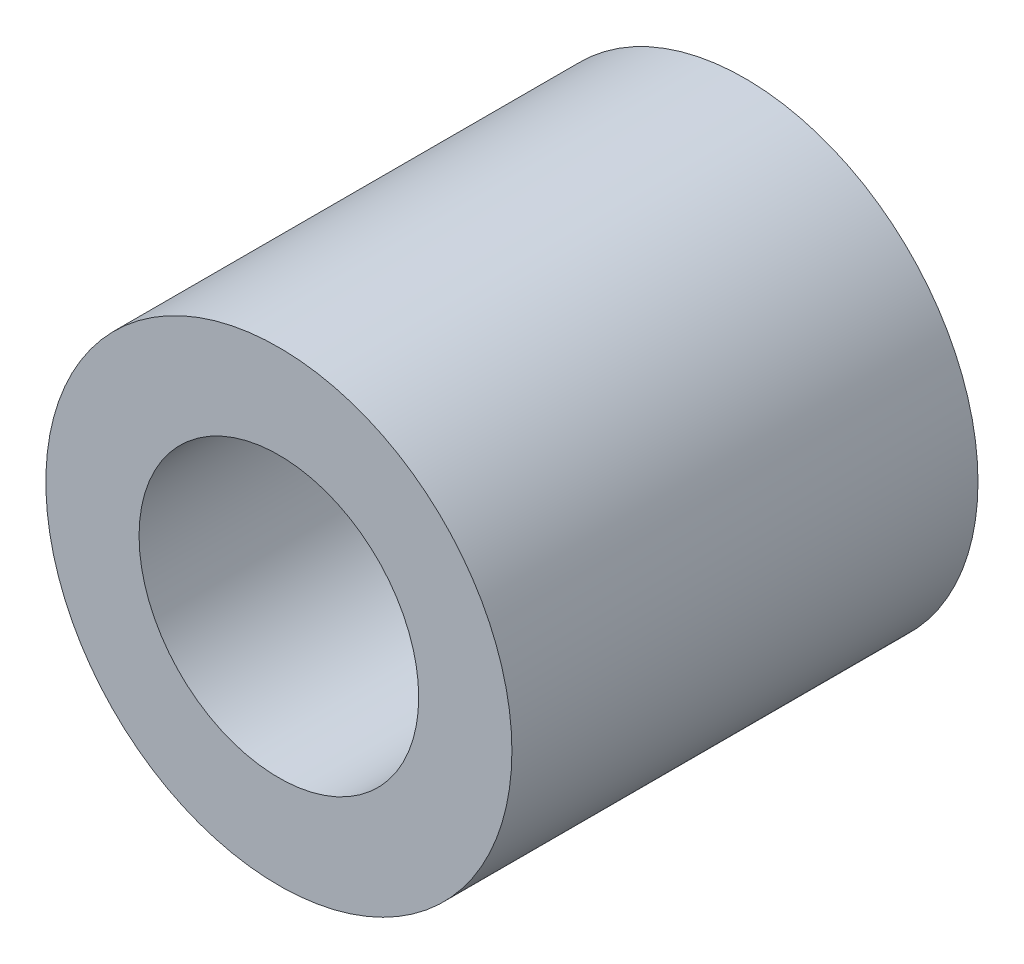
ISO-10303-21;
HEADER;
FILE_DESCRIPTION(('STEP AP214'),'2;1');
FILE_NAME('part.step','',(''),(''),'','','');
FILE_SCHEMA(('AUTOMOTIVE_DESIGN { 1 0 10303 214 1 1 1 1 }'));
ENDSEC;
DATA;
#1=APPLICATION_CONTEXT('core data for automotive mechanical design processes');
#2=APPLICATION_PROTOCOL_DEFINITION('international standard','automotive_design',2000,#1);
#3=PRODUCT_CONTEXT('',#1,'mechanical');
#4=PRODUCT('Part','Part','',(#3));
#5=PRODUCT_RELATED_PRODUCT_CATEGORY('part','',(#4));
#6=PRODUCT_DEFINITION_FORMATION('','',#4);
#7=PRODUCT_DEFINITION_CONTEXT('part definition',#1,'design');
#8=PRODUCT_DEFINITION('design','',#6,#7);
#9=PRODUCT_DEFINITION_SHAPE('','',#8);
#10=(LENGTH_UNIT() NAMED_UNIT(*) SI_UNIT(.MILLI.,.METRE.));
#11=(NAMED_UNIT(*) PLANE_ANGLE_UNIT() SI_UNIT($,.RADIAN.));
#12=(NAMED_UNIT(*) SI_UNIT($,.STERADIAN.) SOLID_ANGLE_UNIT());
#13=UNCERTAINTY_MEASURE_WITH_UNIT(LENGTH_MEASURE(1.E-05),#10,'distance_accuracy_value','');
#14=(GEOMETRIC_REPRESENTATION_CONTEXT(3) GLOBAL_UNCERTAINTY_ASSIGNED_CONTEXT((#13)) GLOBAL_UNIT_ASSIGNED_CONTEXT((#10,
#11,#12)) REPRESENTATION_CONTEXT('',''));
#15=CARTESIAN_POINT('',(0.,0.,0.));
#16=DIRECTION('',(0.,0.,1.));
#17=DIRECTION('',(1.,0.,0.));
#18=AXIS2_PLACEMENT_3D('',#15,#16,#17);
#19=CARTESIAN_POINT('',(0.,0.,5.));
#20=DIRECTION('',(0.,0.,-1.));
#21=DIRECTION('',(-1.,0.,0.));
#22=AXIS2_PLACEMENT_3D('',#19,#20,#21);
#23=CYLINDRICAL_SURFACE('',#22,2.5);
#24=CARTESIAN_POINT('',(0.,0.,5.));
#25=DIRECTION('',(0.,0.,1.));
#26=DIRECTION('',(1.,0.,0.));
#27=AXIS2_PLACEMENT_3D('',#24,#25,#26);
#28=CIRCLE('',#27,2.5);
#29=CARTESIAN_POINT('',(2.5,0.,5.));
#30=VERTEX_POINT('',#29);
#31=EDGE_CURVE('E10',#30,#30,#28,.T.);
#32=ORIENTED_EDGE('',*,*,#31,.F.);
#33=EDGE_LOOP('',(#32));
#34=FACE_BOUND('',#33,.T.);
#35=CARTESIAN_POINT('',(0.,0.,0.));
#36=DIRECTION('',(0.,0.,1.));
#37=DIRECTION('',(1.,0.,0.));
#38=AXIS2_PLACEMENT_3D('',#35,#36,#37);
#39=CIRCLE('',#38,2.5);
#40=CARTESIAN_POINT('',(2.5,0.,0.));
#41=VERTEX_POINT('',#40);
#42=EDGE_CURVE('E35',#41,#41,#39,.T.);
#43=ORIENTED_EDGE('',*,*,#42,.T.);
#44=EDGE_LOOP('',(#43));
#45=FACE_BOUND('',#44,.T.);
#46=ADVANCED_FACE('F32',(#34,#45),#23,.T.);
#47=CARTESIAN_POINT('',(0.,0.,5.));
#48=DIRECTION('',(0.,0.,1.));
#49=DIRECTION('',(1.,0.,0.));
#50=AXIS2_PLACEMENT_3D('',#47,#48,#49);
#51=PLANE('',#50);
#52=CARTESIAN_POINT('',(0.,0.,5.));
#53=DIRECTION('',(0.,0.,1.));
#54=DIRECTION('',(1.,0.,0.));
#55=AXIS2_PLACEMENT_3D('',#52,#53,#54);
#56=CIRCLE('',#55,1.5);
#57=CARTESIAN_POINT('',(1.5,0.,5.));
#58=VERTEX_POINT('',#57);
#59=EDGE_CURVE('E46',#58,#58,#56,.T.);
#60=ORIENTED_EDGE('',*,*,#59,.F.);
#61=EDGE_LOOP('',(#60));
#62=FACE_BOUND('',#61,.T.);
#63=ORIENTED_EDGE('',*,*,#31,.T.);
#64=EDGE_LOOP('',(#63));
#65=FACE_BOUND('',#64,.T.);
#66=ADVANCED_FACE('F53',(#62,#65),#51,.T.);
#67=CARTESIAN_POINT('',(0.,0.,0.));
#68=DIRECTION('',(0.,0.,1.));
#69=DIRECTION('',(1.,0.,0.));
#70=AXIS2_PLACEMENT_3D('',#67,#68,#69);
#71=PLANE('',#70);
#72=CARTESIAN_POINT('',(0.,0.,0.));
#73=DIRECTION('',(0.,0.,1.));
#74=DIRECTION('',(1.,0.,0.));
#75=AXIS2_PLACEMENT_3D('',#72,#73,#74);
#76=CIRCLE('',#75,1.5);
#77=CARTESIAN_POINT('',(1.5,0.,0.));
#78=VERTEX_POINT('',#77);
#79=EDGE_CURVE('E42',#78,#78,#76,.F.);
#80=ORIENTED_EDGE('',*,*,#79,.F.);
#81=EDGE_LOOP('',(#80));
#82=FACE_BOUND('',#81,.T.);
#83=ORIENTED_EDGE('',*,*,#42,.F.);
#84=EDGE_LOOP('',(#83));
#85=FACE_BOUND('',#84,.T.);
#86=ADVANCED_FACE('F55',(#82,#85),#71,.F.);
#87=CARTESIAN_POINT('',(0.,0.,-0.00100000000000013));
#88=DIRECTION('',(0.,0.,1.));
#89=DIRECTION('',(1.,0.,0.));
#90=AXIS2_PLACEMENT_3D('',#87,#88,#89);
#91=CYLINDRICAL_SURFACE('',#90,1.5);
#92=ORIENTED_EDGE('',*,*,#59,.T.);
#93=EDGE_LOOP('',(#92));
#94=FACE_BOUND('',#93,.T.);
#95=ORIENTED_EDGE('',*,*,#79,.T.);
#96=EDGE_LOOP('',(#95));
#97=FACE_BOUND('',#96,.T.);
#98=ADVANCED_FACE('F50',(#94,#97),#91,.F.);
#99=CLOSED_SHELL('',(#46,#66,#86,#98));
#100=MANIFOLD_SOLID_BREP('B2',#99);
#101=ADVANCED_BREP_SHAPE_REPRESENTATION('',(#18,#100),#14);
#102=SHAPE_DEFINITION_REPRESENTATION(#9,#101);
ENDSEC;
END-ISO-10303-21;
